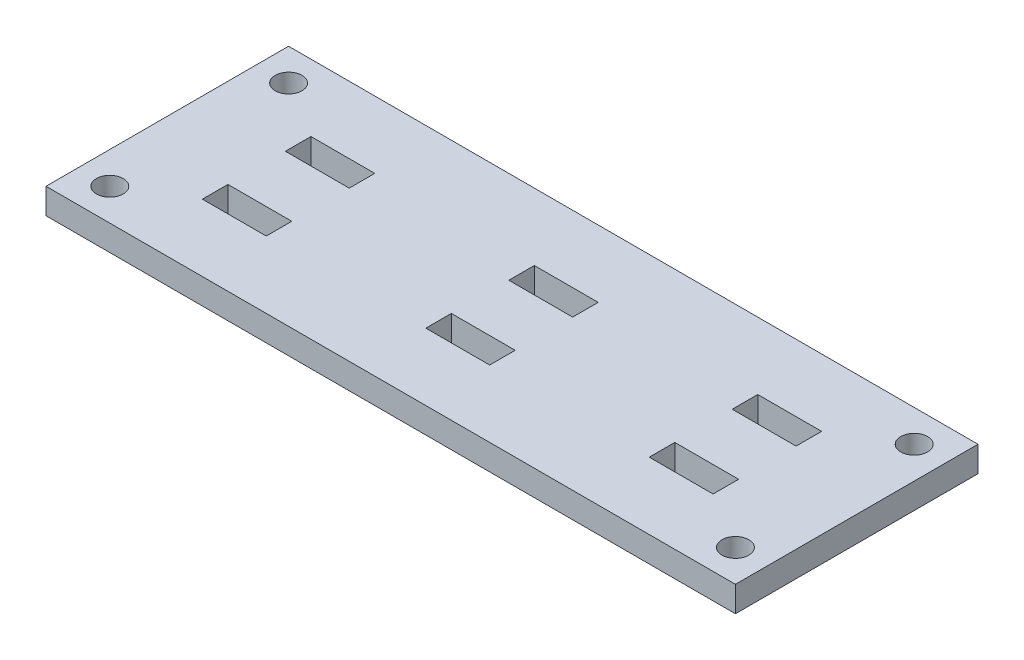
ISO-10303-21;
HEADER;
FILE_DESCRIPTION(('STEP AP214'),'2;1');
FILE_NAME('part.step','',(''),(''),'','','');
FILE_SCHEMA(('AUTOMOTIVE_DESIGN { 1 0 10303 214 1 1 1 1 }'));
ENDSEC;
DATA;
#1=APPLICATION_CONTEXT('core data for automotive mechanical design processes');
#2=APPLICATION_PROTOCOL_DEFINITION('international standard','automotive_design',2000,#1);
#3=PRODUCT_CONTEXT('',#1,'mechanical');
#4=PRODUCT('Part','Part','',(#3));
#5=PRODUCT_RELATED_PRODUCT_CATEGORY('part','',(#4));
#6=PRODUCT_DEFINITION_FORMATION('','',#4);
#7=PRODUCT_DEFINITION_CONTEXT('part definition',#1,'design');
#8=PRODUCT_DEFINITION('design','',#6,#7);
#9=PRODUCT_DEFINITION_SHAPE('','',#8);
#10=(LENGTH_UNIT() NAMED_UNIT(*) SI_UNIT(.MILLI.,.METRE.));
#11=(NAMED_UNIT(*) PLANE_ANGLE_UNIT() SI_UNIT($,.RADIAN.));
#12=(NAMED_UNIT(*) SI_UNIT($,.STERADIAN.) SOLID_ANGLE_UNIT());
#13=UNCERTAINTY_MEASURE_WITH_UNIT(LENGTH_MEASURE(1.E-05),#10,'distance_accuracy_value','');
#14=(GEOMETRIC_REPRESENTATION_CONTEXT(3) GLOBAL_UNCERTAINTY_ASSIGNED_CONTEXT((#13)) GLOBAL_UNIT_ASSIGNED_CONTEXT((#10,
#11,#12)) REPRESENTATION_CONTEXT('',''));
#15=CARTESIAN_POINT('',(0.,0.,0.));
#16=DIRECTION('',(0.,0.,1.));
#17=DIRECTION('',(1.,0.,0.));
#18=AXIS2_PLACEMENT_3D('',#15,#16,#17);
#19=CARTESIAN_POINT('',(0.,4.,0.));
#20=DIRECTION('',(0.,1.,0.));
#21=DIRECTION('',(0.,0.,1.));
#22=AXIS2_PLACEMENT_3D('',#19,#20,#21);
#23=PLANE('',#22);
#24=CARTESIAN_POINT('',(103.,4.,-5.));
#25=DIRECTION('',(0.,1.,0.));
#26=DIRECTION('',(0.,0.,1.));
#27=AXIS2_PLACEMENT_3D('',#24,#25,#26);
#28=CIRCLE('',#27,2.1);
#29=CARTESIAN_POINT('',(103.,4.,-2.9));
#30=VERTEX_POINT('',#29);
#31=EDGE_CURVE('E415',#30,#30,#28,.T.);
#32=ORIENTED_EDGE('',*,*,#31,.F.);
#33=EDGE_LOOP('',(#32));
#34=FACE_BOUND('',#33,.T.);
#35=CARTESIAN_POINT('',(5.,4.,-33.));
#36=DIRECTION('',(0.,1.,0.));
#37=DIRECTION('',(0.,0.,1.));
#38=AXIS2_PLACEMENT_3D('',#35,#36,#37);
#39=CIRCLE('',#38,2.1);
#40=CARTESIAN_POINT('',(5.,4.,-30.9));
#41=VERTEX_POINT('',#40);
#42=EDGE_CURVE('E427',#41,#41,#39,.T.);
#43=ORIENTED_EDGE('',*,*,#42,.F.);
#44=EDGE_LOOP('',(#43));
#45=FACE_BOUND('',#44,.T.);
#46=DIRECTION('',(0.,0.,1.));
#47=VECTOR('',#46,1.);
#48=CARTESIAN_POINT('',(0.,4.,-38.));
#49=LINE('',#48,#47);
#50=CARTESIAN_POINT('',(0.,4.,-38.));
#51=VERTEX_POINT('',#50);
#52=CARTESIAN_POINT('',(0.,4.,0.));
#53=VERTEX_POINT('',#52);
#54=EDGE_CURVE('E433',#51,#53,#49,.T.);
#55=ORIENTED_EDGE('',*,*,#54,.T.);
#56=DIRECTION('',(1.,0.,0.));
#57=VECTOR('',#56,1.);
#58=CARTESIAN_POINT('',(0.,4.,0.));
#59=LINE('',#58,#57);
#60=CARTESIAN_POINT('',(108.,4.,0.));
#61=VERTEX_POINT('',#60);
#62=EDGE_CURVE('E436',#53,#61,#59,.T.);
#63=ORIENTED_EDGE('',*,*,#62,.T.);
#64=DIRECTION('',(0.,0.,-1.));
#65=VECTOR('',#64,1.);
#66=CARTESIAN_POINT('',(108.,4.,-38.));
#67=LINE('',#66,#65);
#68=CARTESIAN_POINT('',(108.,4.,-38.));
#69=VERTEX_POINT('',#68);
#70=EDGE_CURVE('E439',#61,#69,#67,.T.);
#71=ORIENTED_EDGE('',*,*,#70,.T.);
#72=DIRECTION('',(-1.,0.,0.));
#73=VECTOR('',#72,1.);
#74=CARTESIAN_POINT('',(0.,4.,-38.));
#75=LINE('',#74,#73);
#76=EDGE_CURVE('E441',#69,#51,#75,.T.);
#77=ORIENTED_EDGE('',*,*,#76,.T.);
#78=EDGE_LOOP('',(#55,#63,#71,#77));
#79=FACE_BOUND('',#78,.T.);
#80=CARTESIAN_POINT('',(5.,4.,-5.));
#81=DIRECTION('',(0.,1.,0.));
#82=DIRECTION('',(0.,0.,1.));
#83=AXIS2_PLACEMENT_3D('',#80,#81,#82);
#84=CIRCLE('',#83,2.1);
#85=CARTESIAN_POINT('',(5.,4.,-2.9));
#86=VERTEX_POINT('',#85);
#87=EDGE_CURVE('E421',#86,#86,#84,.T.);
#88=ORIENTED_EDGE('',*,*,#87,.F.);
#89=EDGE_LOOP('',(#88));
#90=FACE_BOUND('',#89,.T.);
#91=CARTESIAN_POINT('',(103.,4.,-33.));
#92=DIRECTION('',(0.,1.,0.));
#93=DIRECTION('',(0.,0.,1.));
#94=AXIS2_PLACEMENT_3D('',#91,#92,#93);
#95=CIRCLE('',#94,2.1);
#96=CARTESIAN_POINT('',(103.,4.,-30.9));
#97=VERTEX_POINT('',#96);
#98=EDGE_CURVE('E409',#97,#97,#95,.T.);
#99=ORIENTED_EDGE('',*,*,#98,.F.);
#100=EDGE_LOOP('',(#99));
#101=FACE_BOUND('',#100,.T.);
#102=DIRECTION('',(1.,0.,0.));
#103=VECTOR('',#102,1.);
#104=CARTESIAN_POINT('',(14.,4.,-23.5));
#105=LINE('',#104,#103);
#106=CARTESIAN_POINT('',(14.,4.,-23.5));
#107=VERTEX_POINT('',#106);
#108=CARTESIAN_POINT('',(24.,4.,-23.5));
#109=VERTEX_POINT('',#108);
#110=EDGE_CURVE('E380',#107,#109,#105,.T.);
#111=ORIENTED_EDGE('',*,*,#110,.F.);
#112=DIRECTION('',(0.,0.,1.));
#113=VECTOR('',#112,1.);
#114=CARTESIAN_POINT('',(14.,4.,-23.5));
#115=LINE('',#114,#113);
#116=CARTESIAN_POINT('',(14.,4.,-27.5));
#117=VERTEX_POINT('',#116);
#118=EDGE_CURVE('E378',#117,#107,#115,.T.);
#119=ORIENTED_EDGE('',*,*,#118,.F.);
#120=DIRECTION('',(-1.,0.,0.));
#121=VECTOR('',#120,1.);
#122=CARTESIAN_POINT('',(14.,4.,-27.5));
#123=LINE('',#122,#121);
#124=CARTESIAN_POINT('',(24.,4.,-27.5));
#125=VERTEX_POINT('',#124);
#126=EDGE_CURVE('E386',#125,#117,#123,.T.);
#127=ORIENTED_EDGE('',*,*,#126,.F.);
#128=DIRECTION('',(0.,0.,-1.));
#129=VECTOR('',#128,1.);
#130=CARTESIAN_POINT('',(24.,4.,-23.5));
#131=LINE('',#130,#129);
#132=EDGE_CURVE('E383',#109,#125,#131,.T.);
#133=ORIENTED_EDGE('',*,*,#132,.F.);
#134=EDGE_LOOP('',(#111,#119,#127,#133));
#135=FACE_BOUND('',#134,.T.);
#136=DIRECTION('',(1.,0.,0.));
#137=VECTOR('',#136,1.);
#138=CARTESIAN_POINT('',(14.,4.,-10.5));
#139=LINE('',#138,#137);
#140=CARTESIAN_POINT('',(14.,4.,-10.5));
#141=VERTEX_POINT('',#140);
#142=CARTESIAN_POINT('',(24.,4.,-10.5));
#143=VERTEX_POINT('',#142);
#144=EDGE_CURVE('E349',#141,#143,#139,.T.);
#145=ORIENTED_EDGE('',*,*,#144,.F.);
#146=DIRECTION('',(0.,0.,1.));
#147=VECTOR('',#146,1.);
#148=CARTESIAN_POINT('',(14.,4.,-14.5));
#149=LINE('',#148,#147);
#150=CARTESIAN_POINT('',(14.,4.,-14.5));
#151=VERTEX_POINT('',#150);
#152=EDGE_CURVE('E347',#151,#141,#149,.T.);
#153=ORIENTED_EDGE('',*,*,#152,.F.);
#154=DIRECTION('',(-1.,0.,0.));
#155=VECTOR('',#154,1.);
#156=CARTESIAN_POINT('',(14.,4.,-14.5));
#157=LINE('',#156,#155);
#158=CARTESIAN_POINT('',(24.,4.,-14.5));
#159=VERTEX_POINT('',#158);
#160=EDGE_CURVE('E355',#159,#151,#157,.T.);
#161=ORIENTED_EDGE('',*,*,#160,.F.);
#162=DIRECTION('',(0.,0.,-1.));
#163=VECTOR('',#162,1.);
#164=CARTESIAN_POINT('',(24.,4.,-14.5));
#165=LINE('',#164,#163);
#166=EDGE_CURVE('E352',#143,#159,#165,.T.);
#167=ORIENTED_EDGE('',*,*,#166,.F.);
#168=EDGE_LOOP('',(#145,#153,#161,#167));
#169=FACE_BOUND('',#168,.T.);
#170=DIRECTION('',(0.,0.,-1.));
#171=VECTOR('',#170,1.);
#172=CARTESIAN_POINT('',(59.,4.,-23.5));
#173=LINE('',#172,#171);
#174=CARTESIAN_POINT('',(59.,4.,-23.5));
#175=VERTEX_POINT('',#174);
#176=CARTESIAN_POINT('',(59.,4.,-27.5));
#177=VERTEX_POINT('',#176);
#178=EDGE_CURVE('E318',#175,#177,#173,.T.);
#179=ORIENTED_EDGE('',*,*,#178,.F.);
#180=DIRECTION('',(1.,0.,0.));
#181=VECTOR('',#180,1.);
#182=CARTESIAN_POINT('',(49.,4.,-23.5));
#183=LINE('',#182,#181);
#184=CARTESIAN_POINT('',(49.,4.,-23.5));
#185=VERTEX_POINT('',#184);
#186=EDGE_CURVE('E316',#185,#175,#183,.T.);
#187=ORIENTED_EDGE('',*,*,#186,.F.);
#188=DIRECTION('',(0.,0.,1.));
#189=VECTOR('',#188,1.);
#190=CARTESIAN_POINT('',(49.,4.,-23.5));
#191=LINE('',#190,#189);
#192=CARTESIAN_POINT('',(49.,4.,-27.5));
#193=VERTEX_POINT('',#192);
#194=EDGE_CURVE('E324',#193,#185,#191,.T.);
#195=ORIENTED_EDGE('',*,*,#194,.F.);
#196=DIRECTION('',(-1.,0.,0.));
#197=VECTOR('',#196,1.);
#198=CARTESIAN_POINT('',(49.,4.,-27.5));
#199=LINE('',#198,#197);
#200=EDGE_CURVE('E321',#177,#193,#199,.T.);
#201=ORIENTED_EDGE('',*,*,#200,.F.);
#202=EDGE_LOOP('',(#179,#187,#195,#201));
#203=FACE_BOUND('',#202,.T.);
#204=DIRECTION('',(0.,0.,1.));
#205=VECTOR('',#204,1.);
#206=CARTESIAN_POINT('',(49.,4.,-14.5));
#207=LINE('',#206,#205);
#208=CARTESIAN_POINT('',(49.,4.,-14.5));
#209=VERTEX_POINT('',#208);
#210=CARTESIAN_POINT('',(49.,4.,-10.5));
#211=VERTEX_POINT('',#210);
#212=EDGE_CURVE('E287',#209,#211,#207,.T.);
#213=ORIENTED_EDGE('',*,*,#212,.F.);
#214=DIRECTION('',(-1.,0.,0.));
#215=VECTOR('',#214,1.);
#216=CARTESIAN_POINT('',(49.,4.,-14.5));
#217=LINE('',#216,#215);
#218=CARTESIAN_POINT('',(59.,4.,-14.5));
#219=VERTEX_POINT('',#218);
#220=EDGE_CURVE('E285',#219,#209,#217,.T.);
#221=ORIENTED_EDGE('',*,*,#220,.F.);
#222=DIRECTION('',(0.,0.,-1.));
#223=VECTOR('',#222,1.);
#224=CARTESIAN_POINT('',(59.,4.,-14.5));
#225=LINE('',#224,#223);
#226=CARTESIAN_POINT('',(59.,4.,-10.5));
#227=VERTEX_POINT('',#226);
#228=EDGE_CURVE('E293',#227,#219,#225,.T.);
#229=ORIENTED_EDGE('',*,*,#228,.F.);
#230=DIRECTION('',(1.,0.,0.));
#231=VECTOR('',#230,1.);
#232=CARTESIAN_POINT('',(49.,4.,-10.5));
#233=LINE('',#232,#231);
#234=EDGE_CURVE('E290',#211,#227,#233,.T.);
#235=ORIENTED_EDGE('',*,*,#234,.F.);
#236=EDGE_LOOP('',(#213,#221,#229,#235));
#237=FACE_BOUND('',#236,.T.);
#238=DIRECTION('',(0.,0.,-1.));
#239=VECTOR('',#238,1.);
#240=CARTESIAN_POINT('',(94.,4.,-23.5));
#241=LINE('',#240,#239);
#242=CARTESIAN_POINT('',(94.,4.,-23.5));
#243=VERTEX_POINT('',#242);
#244=CARTESIAN_POINT('',(94.,4.,-27.5));
#245=VERTEX_POINT('',#244);
#246=EDGE_CURVE('E256',#243,#245,#241,.T.);
#247=ORIENTED_EDGE('',*,*,#246,.F.);
#248=DIRECTION('',(1.,0.,0.));
#249=VECTOR('',#248,1.);
#250=CARTESIAN_POINT('',(84.,4.,-23.5));
#251=LINE('',#250,#249);
#252=CARTESIAN_POINT('',(84.,4.,-23.5));
#253=VERTEX_POINT('',#252);
#254=EDGE_CURVE('E254',#253,#243,#251,.T.);
#255=ORIENTED_EDGE('',*,*,#254,.F.);
#256=DIRECTION('',(0.,0.,1.));
#257=VECTOR('',#256,1.);
#258=CARTESIAN_POINT('',(84.,4.,-23.5));
#259=LINE('',#258,#257);
#260=CARTESIAN_POINT('',(84.,4.,-27.5));
#261=VERTEX_POINT('',#260);
#262=EDGE_CURVE('E262',#261,#253,#259,.T.);
#263=ORIENTED_EDGE('',*,*,#262,.F.);
#264=DIRECTION('',(-1.,0.,0.));
#265=VECTOR('',#264,1.);
#266=CARTESIAN_POINT('',(84.,4.,-27.5));
#267=LINE('',#266,#265);
#268=EDGE_CURVE('E259',#245,#261,#267,.T.);
#269=ORIENTED_EDGE('',*,*,#268,.F.);
#270=EDGE_LOOP('',(#247,#255,#263,#269));
#271=FACE_BOUND('',#270,.T.);
#272=DIRECTION('',(0.,0.,1.));
#273=VECTOR('',#272,1.);
#274=CARTESIAN_POINT('',(84.,4.,-14.5));
#275=LINE('',#274,#273);
#276=CARTESIAN_POINT('',(84.,4.,-14.5));
#277=VERTEX_POINT('',#276);
#278=CARTESIAN_POINT('',(84.,4.,-10.5));
#279=VERTEX_POINT('',#278);
#280=EDGE_CURVE('E226',#277,#279,#275,.T.);
#281=ORIENTED_EDGE('',*,*,#280,.F.);
#282=DIRECTION('',(-1.,0.,0.));
#283=VECTOR('',#282,1.);
#284=CARTESIAN_POINT('',(84.,4.,-14.5));
#285=LINE('',#284,#283);
#286=CARTESIAN_POINT('',(94.,4.,-14.5));
#287=VERTEX_POINT('',#286);
#288=EDGE_CURVE('E218',#287,#277,#285,.T.);
#289=ORIENTED_EDGE('',*,*,#288,.F.);
#290=DIRECTION('',(0.,0.,-1.));
#291=VECTOR('',#290,1.);
#292=CARTESIAN_POINT('',(94.,4.,-14.5));
#293=LINE('',#292,#291);
#294=CARTESIAN_POINT('',(94.,4.,-10.5));
#295=VERTEX_POINT('',#294);
#296=EDGE_CURVE('E240',#295,#287,#293,.T.);
#297=ORIENTED_EDGE('',*,*,#296,.F.);
#298=DIRECTION('',(1.,0.,0.));
#299=VECTOR('',#298,1.);
#300=CARTESIAN_POINT('',(84.,4.,-10.5));
#301=LINE('',#300,#299);
#302=EDGE_CURVE('E238',#279,#295,#301,.T.);
#303=ORIENTED_EDGE('',*,*,#302,.F.);
#304=EDGE_LOOP('',(#281,#289,#297,#303));
#305=FACE_BOUND('',#304,.T.);
#306=ADVANCED_FACE('F33',(#34,#45,#79,#90,#101,#135,#169,#203,#237,#271,#305),#23,.T.);
#307=CARTESIAN_POINT('',(0.,0.,0.));
#308=DIRECTION('',(0.,1.,0.));
#309=DIRECTION('',(0.,0.,1.));
#310=AXIS2_PLACEMENT_3D('',#307,#308,#309);
#311=PLANE('',#310);
#312=DIRECTION('',(1.,0.,0.));
#313=VECTOR('',#312,1.);
#314=CARTESIAN_POINT('',(84.,0.,-23.5));
#315=LINE('',#314,#313);
#316=CARTESIAN_POINT('',(84.,0.,-23.5));
#317=VERTEX_POINT('',#316);
#318=CARTESIAN_POINT('',(94.,0.,-23.5));
#319=VERTEX_POINT('',#318);
#320=EDGE_CURVE('E234',#317,#319,#315,.T.);
#321=ORIENTED_EDGE('',*,*,#320,.T.);
#322=DIRECTION('',(0.,0.,-1.));
#323=VECTOR('',#322,1.);
#324=CARTESIAN_POINT('',(94.,0.,-23.5));
#325=LINE('',#324,#323);
#326=CARTESIAN_POINT('',(94.,0.,-27.5));
#327=VERTEX_POINT('',#326);
#328=EDGE_CURVE('E267',#319,#327,#325,.T.);
#329=ORIENTED_EDGE('',*,*,#328,.T.);
#330=DIRECTION('',(-1.,0.,0.));
#331=VECTOR('',#330,1.);
#332=CARTESIAN_POINT('',(84.,0.,-27.5));
#333=LINE('',#332,#331);
#334=CARTESIAN_POINT('',(84.,0.,-27.5));
#335=VERTEX_POINT('',#334);
#336=EDGE_CURVE('E270',#327,#335,#333,.T.);
#337=ORIENTED_EDGE('',*,*,#336,.T.);
#338=DIRECTION('',(0.,0.,1.));
#339=VECTOR('',#338,1.);
#340=CARTESIAN_POINT('',(84.,0.,-23.5));
#341=LINE('',#340,#339);
#342=EDGE_CURVE('E257',#335,#317,#341,.T.);
#343=ORIENTED_EDGE('',*,*,#342,.T.);
#344=EDGE_LOOP('',(#321,#329,#337,#343));
#345=FACE_BOUND('',#344,.T.);
#346=DIRECTION('',(1.,0.,0.));
#347=VECTOR('',#346,1.);
#348=CARTESIAN_POINT('',(49.,0.,-23.5));
#349=LINE('',#348,#347);
#350=CARTESIAN_POINT('',(49.,0.,-23.5));
#351=VERTEX_POINT('',#350);
#352=CARTESIAN_POINT('',(59.,0.,-23.5));
#353=VERTEX_POINT('',#352);
#354=EDGE_CURVE('E315',#351,#353,#349,.T.);
#355=ORIENTED_EDGE('',*,*,#354,.T.);
#356=DIRECTION('',(0.,0.,-1.));
#357=VECTOR('',#356,1.);
#358=CARTESIAN_POINT('',(59.,0.,-23.5));
#359=LINE('',#358,#357);
#360=CARTESIAN_POINT('',(59.,0.,-27.5));
#361=VERTEX_POINT('',#360);
#362=EDGE_CURVE('E329',#353,#361,#359,.T.);
#363=ORIENTED_EDGE('',*,*,#362,.T.);
#364=DIRECTION('',(-1.,0.,0.));
#365=VECTOR('',#364,1.);
#366=CARTESIAN_POINT('',(49.,0.,-27.5));
#367=LINE('',#366,#365);
#368=CARTESIAN_POINT('',(49.,0.,-27.5));
#369=VERTEX_POINT('',#368);
#370=EDGE_CURVE('E332',#361,#369,#367,.T.);
#371=ORIENTED_EDGE('',*,*,#370,.T.);
#372=DIRECTION('',(0.,0.,1.));
#373=VECTOR('',#372,1.);
#374=CARTESIAN_POINT('',(49.,0.,-23.5));
#375=LINE('',#374,#373);
#376=EDGE_CURVE('E319',#369,#351,#375,.T.);
#377=ORIENTED_EDGE('',*,*,#376,.T.);
#378=EDGE_LOOP('',(#355,#363,#371,#377));
#379=FACE_BOUND('',#378,.T.);
#380=DIRECTION('',(0.,0.,1.));
#381=VECTOR('',#380,1.);
#382=CARTESIAN_POINT('',(14.,0.,-23.5));
#383=LINE('',#382,#381);
#384=CARTESIAN_POINT('',(14.,0.,-27.5));
#385=VERTEX_POINT('',#384);
#386=CARTESIAN_POINT('',(14.,0.,-23.5));
#387=VERTEX_POINT('',#386);
#388=EDGE_CURVE('E377',#385,#387,#383,.T.);
#389=ORIENTED_EDGE('',*,*,#388,.T.);
#390=DIRECTION('',(1.,0.,0.));
#391=VECTOR('',#390,1.);
#392=CARTESIAN_POINT('',(14.,0.,-23.5));
#393=LINE('',#392,#391);
#394=CARTESIAN_POINT('',(24.,0.,-23.5));
#395=VERTEX_POINT('',#394);
#396=EDGE_CURVE('E391',#387,#395,#393,.T.);
#397=ORIENTED_EDGE('',*,*,#396,.T.);
#398=DIRECTION('',(0.,0.,-1.));
#399=VECTOR('',#398,1.);
#400=CARTESIAN_POINT('',(24.,0.,-23.5));
#401=LINE('',#400,#399);
#402=CARTESIAN_POINT('',(24.,0.,-27.5));
#403=VERTEX_POINT('',#402);
#404=EDGE_CURVE('E394',#395,#403,#401,.T.);
#405=ORIENTED_EDGE('',*,*,#404,.T.);
#406=DIRECTION('',(-1.,0.,0.));
#407=VECTOR('',#406,1.);
#408=CARTESIAN_POINT('',(14.,0.,-27.5));
#409=LINE('',#408,#407);
#410=EDGE_CURVE('E381',#403,#385,#409,.T.);
#411=ORIENTED_EDGE('',*,*,#410,.T.);
#412=EDGE_LOOP('',(#389,#397,#405,#411));
#413=FACE_BOUND('',#412,.T.);
#414=DIRECTION('',(0.,0.,1.));
#415=VECTOR('',#414,1.);
#416=CARTESIAN_POINT('',(0.,0.,-38.));
#417=LINE('',#416,#415);
#418=CARTESIAN_POINT('',(0.,0.,-38.));
#419=VERTEX_POINT('',#418);
#420=CARTESIAN_POINT('',(0.,0.,0.));
#421=VERTEX_POINT('',#420);
#422=EDGE_CURVE('E430',#419,#421,#417,.T.);
#423=ORIENTED_EDGE('',*,*,#422,.F.);
#424=DIRECTION('',(-1.,0.,0.));
#425=VECTOR('',#424,1.);
#426=CARTESIAN_POINT('',(0.,0.,-38.));
#427=LINE('',#426,#425);
#428=CARTESIAN_POINT('',(108.,0.,-38.));
#429=VERTEX_POINT('',#428);
#430=EDGE_CURVE('E437',#429,#419,#427,.T.);
#431=ORIENTED_EDGE('',*,*,#430,.F.);
#432=DIRECTION('',(0.,0.,-1.));
#433=VECTOR('',#432,1.);
#434=CARTESIAN_POINT('',(108.,0.,-38.));
#435=LINE('',#434,#433);
#436=CARTESIAN_POINT('',(108.,0.,0.));
#437=VERTEX_POINT('',#436);
#438=EDGE_CURVE('E448',#437,#429,#435,.T.);
#439=ORIENTED_EDGE('',*,*,#438,.F.);
#440=DIRECTION('',(1.,0.,0.));
#441=VECTOR('',#440,1.);
#442=CARTESIAN_POINT('',(0.,0.,0.));
#443=LINE('',#442,#441);
#444=EDGE_CURVE('E446',#421,#437,#443,.T.);
#445=ORIENTED_EDGE('',*,*,#444,.F.);
#446=EDGE_LOOP('',(#423,#431,#439,#445));
#447=FACE_BOUND('',#446,.T.);
#448=CARTESIAN_POINT('',(5.,0.,-33.));
#449=DIRECTION('',(0.,1.,0.));
#450=DIRECTION('',(0.,0.,1.));
#451=AXIS2_PLACEMENT_3D('',#448,#449,#450);
#452=CIRCLE('',#451,2.1);
#453=CARTESIAN_POINT('',(5.,0.,-30.9));
#454=VERTEX_POINT('',#453);
#455=EDGE_CURVE('E424',#454,#454,#452,.T.);
#456=ORIENTED_EDGE('',*,*,#455,.T.);
#457=EDGE_LOOP('',(#456));
#458=FACE_BOUND('',#457,.T.);
#459=CARTESIAN_POINT('',(5.,0.,-5.));
#460=DIRECTION('',(0.,1.,0.));
#461=DIRECTION('',(0.,0.,1.));
#462=AXIS2_PLACEMENT_3D('',#459,#460,#461);
#463=CIRCLE('',#462,2.1);
#464=CARTESIAN_POINT('',(5.,0.,-2.9));
#465=VERTEX_POINT('',#464);
#466=EDGE_CURVE('E418',#465,#465,#463,.T.);
#467=ORIENTED_EDGE('',*,*,#466,.T.);
#468=EDGE_LOOP('',(#467));
#469=FACE_BOUND('',#468,.T.);
#470=CARTESIAN_POINT('',(103.,0.,-5.));
#471=DIRECTION('',(0.,1.,0.));
#472=DIRECTION('',(0.,0.,1.));
#473=AXIS2_PLACEMENT_3D('',#470,#471,#472);
#474=CIRCLE('',#473,2.1);
#475=CARTESIAN_POINT('',(103.,0.,-2.9));
#476=VERTEX_POINT('',#475);
#477=EDGE_CURVE('E412',#476,#476,#474,.T.);
#478=ORIENTED_EDGE('',*,*,#477,.T.);
#479=EDGE_LOOP('',(#478));
#480=FACE_BOUND('',#479,.T.);
#481=CARTESIAN_POINT('',(103.,0.,-33.));
#482=DIRECTION('',(0.,1.,0.));
#483=DIRECTION('',(0.,0.,1.));
#484=AXIS2_PLACEMENT_3D('',#481,#482,#483);
#485=CIRCLE('',#484,2.1);
#486=CARTESIAN_POINT('',(103.,0.,-30.9));
#487=VERTEX_POINT('',#486);
#488=EDGE_CURVE('E408',#487,#487,#485,.T.);
#489=ORIENTED_EDGE('',*,*,#488,.T.);
#490=EDGE_LOOP('',(#489));
#491=FACE_BOUND('',#490,.T.);
#492=DIRECTION('',(0.,0.,1.));
#493=VECTOR('',#492,1.);
#494=CARTESIAN_POINT('',(14.,0.,-14.5));
#495=LINE('',#494,#493);
#496=CARTESIAN_POINT('',(14.,0.,-14.5));
#497=VERTEX_POINT('',#496);
#498=CARTESIAN_POINT('',(14.,0.,-10.5));
#499=VERTEX_POINT('',#498);
#500=EDGE_CURVE('E346',#497,#499,#495,.T.);
#501=ORIENTED_EDGE('',*,*,#500,.T.);
#502=DIRECTION('',(1.,0.,0.));
#503=VECTOR('',#502,1.);
#504=CARTESIAN_POINT('',(14.,0.,-10.5));
#505=LINE('',#504,#503);
#506=CARTESIAN_POINT('',(24.,0.,-10.5));
#507=VERTEX_POINT('',#506);
#508=EDGE_CURVE('E360',#499,#507,#505,.T.);
#509=ORIENTED_EDGE('',*,*,#508,.T.);
#510=DIRECTION('',(0.,0.,-1.));
#511=VECTOR('',#510,1.);
#512=CARTESIAN_POINT('',(24.,0.,-14.5));
#513=LINE('',#512,#511);
#514=CARTESIAN_POINT('',(24.,0.,-14.5));
#515=VERTEX_POINT('',#514);
#516=EDGE_CURVE('E363',#507,#515,#513,.T.);
#517=ORIENTED_EDGE('',*,*,#516,.T.);
#518=DIRECTION('',(-1.,0.,0.));
#519=VECTOR('',#518,1.);
#520=CARTESIAN_POINT('',(14.,0.,-14.5));
#521=LINE('',#520,#519);
#522=EDGE_CURVE('E350',#515,#497,#521,.T.);
#523=ORIENTED_EDGE('',*,*,#522,.T.);
#524=EDGE_LOOP('',(#501,#509,#517,#523));
#525=FACE_BOUND('',#524,.T.);
#526=DIRECTION('',(-1.,0.,0.));
#527=VECTOR('',#526,1.);
#528=CARTESIAN_POINT('',(49.,0.,-14.5));
#529=LINE('',#528,#527);
#530=CARTESIAN_POINT('',(59.,0.,-14.5));
#531=VERTEX_POINT('',#530);
#532=CARTESIAN_POINT('',(49.,0.,-14.5));
#533=VERTEX_POINT('',#532);
#534=EDGE_CURVE('E284',#531,#533,#529,.T.);
#535=ORIENTED_EDGE('',*,*,#534,.T.);
#536=DIRECTION('',(0.,0.,1.));
#537=VECTOR('',#536,1.);
#538=CARTESIAN_POINT('',(49.,0.,-14.5));
#539=LINE('',#538,#537);
#540=CARTESIAN_POINT('',(49.,0.,-10.5));
#541=VERTEX_POINT('',#540);
#542=EDGE_CURVE('E298',#533,#541,#539,.T.);
#543=ORIENTED_EDGE('',*,*,#542,.T.);
#544=DIRECTION('',(1.,0.,0.));
#545=VECTOR('',#544,1.);
#546=CARTESIAN_POINT('',(49.,0.,-10.5));
#547=LINE('',#546,#545);
#548=CARTESIAN_POINT('',(59.,0.,-10.5));
#549=VERTEX_POINT('',#548);
#550=EDGE_CURVE('E301',#541,#549,#547,.T.);
#551=ORIENTED_EDGE('',*,*,#550,.T.);
#552=DIRECTION('',(0.,0.,-1.));
#553=VECTOR('',#552,1.);
#554=CARTESIAN_POINT('',(59.,0.,-14.5));
#555=LINE('',#554,#553);
#556=EDGE_CURVE('E288',#549,#531,#555,.T.);
#557=ORIENTED_EDGE('',*,*,#556,.T.);
#558=EDGE_LOOP('',(#535,#543,#551,#557));
#559=FACE_BOUND('',#558,.T.);
#560=DIRECTION('',(-1.,0.,0.));
#561=VECTOR('',#560,1.);
#562=CARTESIAN_POINT('',(84.,0.,-14.5));
#563=LINE('',#562,#561);
#564=CARTESIAN_POINT('',(94.,0.,-14.5));
#565=VERTEX_POINT('',#564);
#566=CARTESIAN_POINT('',(84.,0.,-14.5));
#567=VERTEX_POINT('',#566);
#568=EDGE_CURVE('E56',#565,#567,#563,.T.);
#569=ORIENTED_EDGE('',*,*,#568,.T.);
#570=DIRECTION('',(0.,0.,1.));
#571=VECTOR('',#570,1.);
#572=CARTESIAN_POINT('',(84.,0.,-14.5));
#573=LINE('',#572,#571);
#574=CARTESIAN_POINT('',(84.,0.,-10.5));
#575=VERTEX_POINT('',#574);
#576=EDGE_CURVE('E233',#567,#575,#573,.T.);
#577=ORIENTED_EDGE('',*,*,#576,.T.);
#578=DIRECTION('',(1.,0.,0.));
#579=VECTOR('',#578,1.);
#580=CARTESIAN_POINT('',(84.,0.,-10.5));
#581=LINE('',#580,#579);
#582=CARTESIAN_POINT('',(94.,0.,-10.5));
#583=VERTEX_POINT('',#582);
#584=EDGE_CURVE('E246',#575,#583,#581,.T.);
#585=ORIENTED_EDGE('',*,*,#584,.T.);
#586=DIRECTION('',(0.,0.,-1.));
#587=VECTOR('',#586,1.);
#588=CARTESIAN_POINT('',(94.,0.,-14.5));
#589=LINE('',#588,#587);
#590=EDGE_CURVE('E227',#583,#565,#589,.T.);
#591=ORIENTED_EDGE('',*,*,#590,.T.);
#592=EDGE_LOOP('',(#569,#577,#585,#591));
#593=FACE_BOUND('',#592,.T.);
#594=ADVANCED_FACE('F466',(#345,#379,#413,#447,#458,#469,#480,#491,#525,#559,#593),#311,.F.);
#595=CARTESIAN_POINT('',(0.,4.,-38.));
#596=DIRECTION('',(1.,0.,0.));
#597=DIRECTION('',(0.,0.,-1.));
#598=AXIS2_PLACEMENT_3D('',#595,#596,#597);
#599=PLANE('',#598);
#600=ORIENTED_EDGE('',*,*,#422,.T.);
#601=DIRECTION('',(0.,-1.,0.));
#602=VECTOR('',#601,1.);
#603=CARTESIAN_POINT('',(0.,4.,0.));
#604=LINE('',#603,#602);
#605=EDGE_CURVE('E11',#53,#421,#604,.T.);
#606=ORIENTED_EDGE('',*,*,#605,.F.);
#607=ORIENTED_EDGE('',*,*,#54,.F.);
#608=DIRECTION('',(0.,-1.,0.));
#609=VECTOR('',#608,1.);
#610=CARTESIAN_POINT('',(0.,4.,-38.));
#611=LINE('',#610,#609);
#612=EDGE_CURVE('E443',#51,#419,#611,.T.);
#613=ORIENTED_EDGE('',*,*,#612,.T.);
#614=EDGE_LOOP('',(#600,#606,#607,#613));
#615=FACE_BOUND('',#614,.T.);
#616=ADVANCED_FACE('F35',(#615),#599,.F.);
#617=CARTESIAN_POINT('',(0.,4.,0.));
#618=DIRECTION('',(0.,0.,-1.));
#619=DIRECTION('',(-1.,0.,0.));
#620=AXIS2_PLACEMENT_3D('',#617,#618,#619);
#621=PLANE('',#620);
#622=ORIENTED_EDGE('',*,*,#444,.T.);
#623=DIRECTION('',(0.,-1.,0.));
#624=VECTOR('',#623,1.);
#625=CARTESIAN_POINT('',(108.,4.,0.));
#626=LINE('',#625,#624);
#627=EDGE_CURVE('E41',#61,#437,#626,.T.);
#628=ORIENTED_EDGE('',*,*,#627,.F.);
#629=ORIENTED_EDGE('',*,*,#62,.F.);
#630=ORIENTED_EDGE('',*,*,#605,.T.);
#631=EDGE_LOOP('',(#622,#628,#629,#630));
#632=FACE_BOUND('',#631,.T.);
#633=ADVANCED_FACE('F477',(#632),#621,.F.);
#634=CARTESIAN_POINT('',(108.,4.,-38.));
#635=DIRECTION('',(-1.,0.,0.));
#636=DIRECTION('',(0.,0.,1.));
#637=AXIS2_PLACEMENT_3D('',#634,#635,#636);
#638=PLANE('',#637);
#639=ORIENTED_EDGE('',*,*,#438,.T.);
#640=DIRECTION('',(0.,-1.,0.));
#641=VECTOR('',#640,1.);
#642=CARTESIAN_POINT('',(108.,4.,-38.));
#643=LINE('',#642,#641);
#644=EDGE_CURVE('E453',#69,#429,#643,.T.);
#645=ORIENTED_EDGE('',*,*,#644,.F.);
#646=ORIENTED_EDGE('',*,*,#70,.F.);
#647=ORIENTED_EDGE('',*,*,#627,.T.);
#648=EDGE_LOOP('',(#639,#645,#646,#647));
#649=FACE_BOUND('',#648,.T.);
#650=ADVANCED_FACE('F460',(#649),#638,.F.);
#651=CARTESIAN_POINT('',(0.,4.,-38.));
#652=DIRECTION('',(0.,0.,1.));
#653=DIRECTION('',(1.,0.,0.));
#654=AXIS2_PLACEMENT_3D('',#651,#652,#653);
#655=PLANE('',#654);
#656=ORIENTED_EDGE('',*,*,#430,.T.);
#657=ORIENTED_EDGE('',*,*,#612,.F.);
#658=ORIENTED_EDGE('',*,*,#76,.F.);
#659=ORIENTED_EDGE('',*,*,#644,.T.);
#660=EDGE_LOOP('',(#656,#657,#658,#659));
#661=FACE_BOUND('',#660,.T.);
#662=ADVANCED_FACE('F470',(#661),#655,.F.);
#663=CARTESIAN_POINT('',(5.,4.,-33.));
#664=DIRECTION('',(0.,-1.,0.));
#665=DIRECTION('',(0.,0.,-1.));
#666=AXIS2_PLACEMENT_3D('',#663,#664,#665);
#667=CYLINDRICAL_SURFACE('',#666,2.1);
#668=ORIENTED_EDGE('',*,*,#42,.T.);
#669=EDGE_LOOP('',(#668));
#670=FACE_BOUND('',#669,.T.);
#671=ORIENTED_EDGE('',*,*,#455,.F.);
#672=EDGE_LOOP('',(#671));
#673=FACE_BOUND('',#672,.T.);
#674=ADVANCED_FACE('F495',(#670,#673),#667,.F.);
#675=CARTESIAN_POINT('',(5.,4.,-5.));
#676=DIRECTION('',(0.,-1.,0.));
#677=DIRECTION('',(0.,0.,-1.));
#678=AXIS2_PLACEMENT_3D('',#675,#676,#677);
#679=CYLINDRICAL_SURFACE('',#678,2.1);
#680=ORIENTED_EDGE('',*,*,#87,.T.);
#681=EDGE_LOOP('',(#680));
#682=FACE_BOUND('',#681,.T.);
#683=ORIENTED_EDGE('',*,*,#466,.F.);
#684=EDGE_LOOP('',(#683));
#685=FACE_BOUND('',#684,.T.);
#686=ADVANCED_FACE('F502',(#682,#685),#679,.F.);
#687=CARTESIAN_POINT('',(103.,4.,-5.));
#688=DIRECTION('',(0.,-1.,0.));
#689=DIRECTION('',(0.,0.,-1.));
#690=AXIS2_PLACEMENT_3D('',#687,#688,#689);
#691=CYLINDRICAL_SURFACE('',#690,2.1);
#692=ORIENTED_EDGE('',*,*,#31,.T.);
#693=EDGE_LOOP('',(#692));
#694=FACE_BOUND('',#693,.T.);
#695=ORIENTED_EDGE('',*,*,#477,.F.);
#696=EDGE_LOOP('',(#695));
#697=FACE_BOUND('',#696,.T.);
#698=ADVANCED_FACE('F507',(#694,#697),#691,.F.);
#699=CARTESIAN_POINT('',(103.,4.,-33.));
#700=DIRECTION('',(0.,-1.,0.));
#701=DIRECTION('',(0.,0.,-1.));
#702=AXIS2_PLACEMENT_3D('',#699,#700,#701);
#703=CYLINDRICAL_SURFACE('',#702,2.1);
#704=ORIENTED_EDGE('',*,*,#98,.T.);
#705=EDGE_LOOP('',(#704));
#706=FACE_BOUND('',#705,.T.);
#707=ORIENTED_EDGE('',*,*,#488,.F.);
#708=EDGE_LOOP('',(#707));
#709=FACE_BOUND('',#708,.T.);
#710=ADVANCED_FACE('F615',(#706,#709),#703,.F.);
#711=CARTESIAN_POINT('',(14.,4.,-23.5));
#712=DIRECTION('',(1.,0.,0.));
#713=DIRECTION('',(0.,0.,-1.));
#714=AXIS2_PLACEMENT_3D('',#711,#712,#713);
#715=PLANE('',#714);
#716=ORIENTED_EDGE('',*,*,#388,.F.);
#717=DIRECTION('',(0.,-1.,0.));
#718=VECTOR('',#717,1.);
#719=CARTESIAN_POINT('',(14.,4.,-27.5));
#720=LINE('',#719,#718);
#721=EDGE_CURVE('E388',#117,#385,#720,.T.);
#722=ORIENTED_EDGE('',*,*,#721,.F.);
#723=ORIENTED_EDGE('',*,*,#118,.T.);
#724=DIRECTION('',(0.,-1.,0.));
#725=VECTOR('',#724,1.);
#726=CARTESIAN_POINT('',(14.,4.,-23.5));
#727=LINE('',#726,#725);
#728=EDGE_CURVE('E405',#107,#387,#727,.T.);
#729=ORIENTED_EDGE('',*,*,#728,.T.);
#730=EDGE_LOOP('',(#716,#722,#723,#729));
#731=FACE_BOUND('',#730,.T.);
#732=ADVANCED_FACE('F611',(#731),#715,.T.);
#733=CARTESIAN_POINT('',(14.,4.,-23.5));
#734=DIRECTION('',(0.,0.,-1.));
#735=DIRECTION('',(-1.,0.,0.));
#736=AXIS2_PLACEMENT_3D('',#733,#734,#735);
#737=PLANE('',#736);
#738=ORIENTED_EDGE('',*,*,#396,.F.);
#739=ORIENTED_EDGE('',*,*,#728,.F.);
#740=ORIENTED_EDGE('',*,*,#110,.T.);
#741=DIRECTION('',(0.,-1.,0.));
#742=VECTOR('',#741,1.);
#743=CARTESIAN_POINT('',(24.,4.,-23.5));
#744=LINE('',#743,#742);
#745=EDGE_CURVE('E403',#109,#395,#744,.T.);
#746=ORIENTED_EDGE('',*,*,#745,.T.);
#747=EDGE_LOOP('',(#738,#739,#740,#746));
#748=FACE_BOUND('',#747,.T.);
#749=ADVANCED_FACE('F607',(#748),#737,.T.);
#750=CARTESIAN_POINT('',(24.,4.,-23.5));
#751=DIRECTION('',(-1.,0.,0.));
#752=DIRECTION('',(0.,0.,1.));
#753=AXIS2_PLACEMENT_3D('',#750,#751,#752);
#754=PLANE('',#753);
#755=ORIENTED_EDGE('',*,*,#404,.F.);
#756=ORIENTED_EDGE('',*,*,#745,.F.);
#757=ORIENTED_EDGE('',*,*,#132,.T.);
#758=DIRECTION('',(0.,-1.,0.));
#759=VECTOR('',#758,1.);
#760=CARTESIAN_POINT('',(24.,4.,-27.5));
#761=LINE('',#760,#759);
#762=EDGE_CURVE('E401',#125,#403,#761,.T.);
#763=ORIENTED_EDGE('',*,*,#762,.T.);
#764=EDGE_LOOP('',(#755,#756,#757,#763));
#765=FACE_BOUND('',#764,.T.);
#766=ADVANCED_FACE('F603',(#765),#754,.T.);
#767=CARTESIAN_POINT('',(14.,4.,-27.5));
#768=DIRECTION('',(0.,0.,1.));
#769=DIRECTION('',(1.,0.,0.));
#770=AXIS2_PLACEMENT_3D('',#767,#768,#769);
#771=PLANE('',#770);
#772=ORIENTED_EDGE('',*,*,#410,.F.);
#773=ORIENTED_EDGE('',*,*,#762,.F.);
#774=ORIENTED_EDGE('',*,*,#126,.T.);
#775=ORIENTED_EDGE('',*,*,#721,.T.);
#776=EDGE_LOOP('',(#772,#773,#774,#775));
#777=FACE_BOUND('',#776,.T.);
#778=ADVANCED_FACE('F599',(#777),#771,.T.);
#779=CARTESIAN_POINT('',(14.,4.,-14.5));
#780=DIRECTION('',(1.,0.,0.));
#781=DIRECTION('',(0.,0.,-1.));
#782=AXIS2_PLACEMENT_3D('',#779,#780,#781);
#783=PLANE('',#782);
#784=ORIENTED_EDGE('',*,*,#500,.F.);
#785=DIRECTION('',(0.,-1.,0.));
#786=VECTOR('',#785,1.);
#787=CARTESIAN_POINT('',(14.,4.,-14.5));
#788=LINE('',#787,#786);
#789=EDGE_CURVE('E357',#151,#497,#788,.T.);
#790=ORIENTED_EDGE('',*,*,#789,.F.);
#791=ORIENTED_EDGE('',*,*,#152,.T.);
#792=DIRECTION('',(0.,-1.,0.));
#793=VECTOR('',#792,1.);
#794=CARTESIAN_POINT('',(14.,4.,-10.5));
#795=LINE('',#794,#793);
#796=EDGE_CURVE('E374',#141,#499,#795,.T.);
#797=ORIENTED_EDGE('',*,*,#796,.T.);
#798=EDGE_LOOP('',(#784,#790,#791,#797));
#799=FACE_BOUND('',#798,.T.);
#800=ADVANCED_FACE('F595',(#799),#783,.T.);
#801=CARTESIAN_POINT('',(14.,4.,-10.5));
#802=DIRECTION('',(0.,0.,-1.));
#803=DIRECTION('',(-1.,0.,0.));
#804=AXIS2_PLACEMENT_3D('',#801,#802,#803);
#805=PLANE('',#804);
#806=ORIENTED_EDGE('',*,*,#508,.F.);
#807=ORIENTED_EDGE('',*,*,#796,.F.);
#808=ORIENTED_EDGE('',*,*,#144,.T.);
#809=DIRECTION('',(0.,-1.,0.));
#810=VECTOR('',#809,1.);
#811=CARTESIAN_POINT('',(24.,4.,-10.5));
#812=LINE('',#811,#810);
#813=EDGE_CURVE('E372',#143,#507,#812,.T.);
#814=ORIENTED_EDGE('',*,*,#813,.T.);
#815=EDGE_LOOP('',(#806,#807,#808,#814));
#816=FACE_BOUND('',#815,.T.);
#817=ADVANCED_FACE('F591',(#816),#805,.T.);
#818=CARTESIAN_POINT('',(24.,4.,-14.5));
#819=DIRECTION('',(-1.,0.,0.));
#820=DIRECTION('',(0.,0.,1.));
#821=AXIS2_PLACEMENT_3D('',#818,#819,#820);
#822=PLANE('',#821);
#823=ORIENTED_EDGE('',*,*,#516,.F.);
#824=ORIENTED_EDGE('',*,*,#813,.F.);
#825=ORIENTED_EDGE('',*,*,#166,.T.);
#826=DIRECTION('',(0.,-1.,0.));
#827=VECTOR('',#826,1.);
#828=CARTESIAN_POINT('',(24.,4.,-14.5));
#829=LINE('',#828,#827);
#830=EDGE_CURVE('E370',#159,#515,#829,.T.);
#831=ORIENTED_EDGE('',*,*,#830,.T.);
#832=EDGE_LOOP('',(#823,#824,#825,#831));
#833=FACE_BOUND('',#832,.T.);
#834=ADVANCED_FACE('F587',(#833),#822,.T.);
#835=CARTESIAN_POINT('',(14.,4.,-14.5));
#836=DIRECTION('',(0.,0.,1.));
#837=DIRECTION('',(1.,0.,0.));
#838=AXIS2_PLACEMENT_3D('',#835,#836,#837);
#839=PLANE('',#838);
#840=ORIENTED_EDGE('',*,*,#522,.F.);
#841=ORIENTED_EDGE('',*,*,#830,.F.);
#842=ORIENTED_EDGE('',*,*,#160,.T.);
#843=ORIENTED_EDGE('',*,*,#789,.T.);
#844=EDGE_LOOP('',(#840,#841,#842,#843));
#845=FACE_BOUND('',#844,.T.);
#846=ADVANCED_FACE('F583',(#845),#839,.T.);
#847=CARTESIAN_POINT('',(49.,4.,-23.5));
#848=DIRECTION('',(0.,0.,-1.));
#849=DIRECTION('',(-1.,0.,0.));
#850=AXIS2_PLACEMENT_3D('',#847,#848,#849);
#851=PLANE('',#850);
#852=ORIENTED_EDGE('',*,*,#354,.F.);
#853=DIRECTION('',(0.,-1.,0.));
#854=VECTOR('',#853,1.);
#855=CARTESIAN_POINT('',(49.,4.,-23.5));
#856=LINE('',#855,#854);
#857=EDGE_CURVE('E326',#185,#351,#856,.T.);
#858=ORIENTED_EDGE('',*,*,#857,.F.);
#859=ORIENTED_EDGE('',*,*,#186,.T.);
#860=DIRECTION('',(0.,-1.,0.));
#861=VECTOR('',#860,1.);
#862=CARTESIAN_POINT('',(59.,4.,-23.5));
#863=LINE('',#862,#861);
#864=EDGE_CURVE('E343',#175,#353,#863,.T.);
#865=ORIENTED_EDGE('',*,*,#864,.T.);
#866=EDGE_LOOP('',(#852,#858,#859,#865));
#867=FACE_BOUND('',#866,.T.);
#868=ADVANCED_FACE('F579',(#867),#851,.T.);
#869=CARTESIAN_POINT('',(59.,4.,-23.5));
#870=DIRECTION('',(-1.,0.,0.));
#871=DIRECTION('',(0.,0.,1.));
#872=AXIS2_PLACEMENT_3D('',#869,#870,#871);
#873=PLANE('',#872);
#874=ORIENTED_EDGE('',*,*,#362,.F.);
#875=ORIENTED_EDGE('',*,*,#864,.F.);
#876=ORIENTED_EDGE('',*,*,#178,.T.);
#877=DIRECTION('',(0.,-1.,0.));
#878=VECTOR('',#877,1.);
#879=CARTESIAN_POINT('',(59.,4.,-27.5));
#880=LINE('',#879,#878);
#881=EDGE_CURVE('E341',#177,#361,#880,.T.);
#882=ORIENTED_EDGE('',*,*,#881,.T.);
#883=EDGE_LOOP('',(#874,#875,#876,#882));
#884=FACE_BOUND('',#883,.T.);
#885=ADVANCED_FACE('F575',(#884),#873,.T.);
#886=CARTESIAN_POINT('',(49.,4.,-27.5));
#887=DIRECTION('',(0.,0.,1.));
#888=DIRECTION('',(1.,0.,0.));
#889=AXIS2_PLACEMENT_3D('',#886,#887,#888);
#890=PLANE('',#889);
#891=ORIENTED_EDGE('',*,*,#370,.F.);
#892=ORIENTED_EDGE('',*,*,#881,.F.);
#893=ORIENTED_EDGE('',*,*,#200,.T.);
#894=DIRECTION('',(0.,-1.,0.));
#895=VECTOR('',#894,1.);
#896=CARTESIAN_POINT('',(49.,4.,-27.5));
#897=LINE('',#896,#895);
#898=EDGE_CURVE('E339',#193,#369,#897,.T.);
#899=ORIENTED_EDGE('',*,*,#898,.T.);
#900=EDGE_LOOP('',(#891,#892,#893,#899));
#901=FACE_BOUND('',#900,.T.);
#902=ADVANCED_FACE('F571',(#901),#890,.T.);
#903=CARTESIAN_POINT('',(49.,4.,-23.5));
#904=DIRECTION('',(1.,0.,0.));
#905=DIRECTION('',(0.,0.,-1.));
#906=AXIS2_PLACEMENT_3D('',#903,#904,#905);
#907=PLANE('',#906);
#908=ORIENTED_EDGE('',*,*,#376,.F.);
#909=ORIENTED_EDGE('',*,*,#898,.F.);
#910=ORIENTED_EDGE('',*,*,#194,.T.);
#911=ORIENTED_EDGE('',*,*,#857,.T.);
#912=EDGE_LOOP('',(#908,#909,#910,#911));
#913=FACE_BOUND('',#912,.T.);
#914=ADVANCED_FACE('F567',(#913),#907,.T.);
#915=CARTESIAN_POINT('',(49.,4.,-14.5));
#916=DIRECTION('',(0.,0.,1.));
#917=DIRECTION('',(1.,0.,0.));
#918=AXIS2_PLACEMENT_3D('',#915,#916,#917);
#919=PLANE('',#918);
#920=ORIENTED_EDGE('',*,*,#534,.F.);
#921=DIRECTION('',(0.,-1.,0.));
#922=VECTOR('',#921,1.);
#923=CARTESIAN_POINT('',(59.,4.,-14.5));
#924=LINE('',#923,#922);
#925=EDGE_CURVE('E295',#219,#531,#924,.T.);
#926=ORIENTED_EDGE('',*,*,#925,.F.);
#927=ORIENTED_EDGE('',*,*,#220,.T.);
#928=DIRECTION('',(0.,-1.,0.));
#929=VECTOR('',#928,1.);
#930=CARTESIAN_POINT('',(49.,4.,-14.5));
#931=LINE('',#930,#929);
#932=EDGE_CURVE('E312',#209,#533,#931,.T.);
#933=ORIENTED_EDGE('',*,*,#932,.T.);
#934=EDGE_LOOP('',(#920,#926,#927,#933));
#935=FACE_BOUND('',#934,.T.);
#936=ADVANCED_FACE('F563',(#935),#919,.T.);
#937=CARTESIAN_POINT('',(49.,4.,-14.5));
#938=DIRECTION('',(1.,0.,0.));
#939=DIRECTION('',(0.,0.,-1.));
#940=AXIS2_PLACEMENT_3D('',#937,#938,#939);
#941=PLANE('',#940);
#942=ORIENTED_EDGE('',*,*,#542,.F.);
#943=ORIENTED_EDGE('',*,*,#932,.F.);
#944=ORIENTED_EDGE('',*,*,#212,.T.);
#945=DIRECTION('',(0.,-1.,0.));
#946=VECTOR('',#945,1.);
#947=CARTESIAN_POINT('',(49.,4.,-10.5));
#948=LINE('',#947,#946);
#949=EDGE_CURVE('E310',#211,#541,#948,.T.);
#950=ORIENTED_EDGE('',*,*,#949,.T.);
#951=EDGE_LOOP('',(#942,#943,#944,#950));
#952=FACE_BOUND('',#951,.T.);
#953=ADVANCED_FACE('F559',(#952),#941,.T.);
#954=CARTESIAN_POINT('',(49.,4.,-10.5));
#955=DIRECTION('',(0.,0.,-1.));
#956=DIRECTION('',(-1.,0.,0.));
#957=AXIS2_PLACEMENT_3D('',#954,#955,#956);
#958=PLANE('',#957);
#959=ORIENTED_EDGE('',*,*,#550,.F.);
#960=ORIENTED_EDGE('',*,*,#949,.F.);
#961=ORIENTED_EDGE('',*,*,#234,.T.);
#962=DIRECTION('',(0.,-1.,0.));
#963=VECTOR('',#962,1.);
#964=CARTESIAN_POINT('',(59.,4.,-10.5));
#965=LINE('',#964,#963);
#966=EDGE_CURVE('E308',#227,#549,#965,.T.);
#967=ORIENTED_EDGE('',*,*,#966,.T.);
#968=EDGE_LOOP('',(#959,#960,#961,#967));
#969=FACE_BOUND('',#968,.T.);
#970=ADVANCED_FACE('F555',(#969),#958,.T.);
#971=CARTESIAN_POINT('',(59.,4.,-14.5));
#972=DIRECTION('',(-1.,0.,0.));
#973=DIRECTION('',(0.,0.,1.));
#974=AXIS2_PLACEMENT_3D('',#971,#972,#973);
#975=PLANE('',#974);
#976=ORIENTED_EDGE('',*,*,#556,.F.);
#977=ORIENTED_EDGE('',*,*,#966,.F.);
#978=ORIENTED_EDGE('',*,*,#228,.T.);
#979=ORIENTED_EDGE('',*,*,#925,.T.);
#980=EDGE_LOOP('',(#976,#977,#978,#979));
#981=FACE_BOUND('',#980,.T.);
#982=ADVANCED_FACE('F551',(#981),#975,.T.);
#983=CARTESIAN_POINT('',(84.,4.,-23.5));
#984=DIRECTION('',(0.,0.,-1.));
#985=DIRECTION('',(-1.,0.,0.));
#986=AXIS2_PLACEMENT_3D('',#983,#984,#985);
#987=PLANE('',#986);
#988=ORIENTED_EDGE('',*,*,#320,.F.);
#989=DIRECTION('',(0.,-1.,0.));
#990=VECTOR('',#989,1.);
#991=CARTESIAN_POINT('',(84.,4.,-23.5));
#992=LINE('',#991,#990);
#993=EDGE_CURVE('E264',#253,#317,#992,.T.);
#994=ORIENTED_EDGE('',*,*,#993,.F.);
#995=ORIENTED_EDGE('',*,*,#254,.T.);
#996=DIRECTION('',(0.,-1.,0.));
#997=VECTOR('',#996,1.);
#998=CARTESIAN_POINT('',(94.,4.,-23.5));
#999=LINE('',#998,#997);
#1000=EDGE_CURVE('E281',#243,#319,#999,.T.);
#1001=ORIENTED_EDGE('',*,*,#1000,.T.);
#1002=EDGE_LOOP('',(#988,#994,#995,#1001));
#1003=FACE_BOUND('',#1002,.T.);
#1004=ADVANCED_FACE('F547',(#1003),#987,.T.);
#1005=CARTESIAN_POINT('',(94.,4.,-23.5));
#1006=DIRECTION('',(-1.,0.,0.));
#1007=DIRECTION('',(0.,0.,1.));
#1008=AXIS2_PLACEMENT_3D('',#1005,#1006,#1007);
#1009=PLANE('',#1008);
#1010=ORIENTED_EDGE('',*,*,#328,.F.);
#1011=ORIENTED_EDGE('',*,*,#1000,.F.);
#1012=ORIENTED_EDGE('',*,*,#246,.T.);
#1013=DIRECTION('',(0.,-1.,0.));
#1014=VECTOR('',#1013,1.);
#1015=CARTESIAN_POINT('',(94.,4.,-27.5));
#1016=LINE('',#1015,#1014);
#1017=EDGE_CURVE('E279',#245,#327,#1016,.T.);
#1018=ORIENTED_EDGE('',*,*,#1017,.T.);
#1019=EDGE_LOOP('',(#1010,#1011,#1012,#1018));
#1020=FACE_BOUND('',#1019,.T.);
#1021=ADVANCED_FACE('F543',(#1020),#1009,.T.);
#1022=CARTESIAN_POINT('',(84.,4.,-27.5));
#1023=DIRECTION('',(0.,0.,1.));
#1024=DIRECTION('',(1.,0.,0.));
#1025=AXIS2_PLACEMENT_3D('',#1022,#1023,#1024);
#1026=PLANE('',#1025);
#1027=ORIENTED_EDGE('',*,*,#336,.F.);
#1028=ORIENTED_EDGE('',*,*,#1017,.F.);
#1029=ORIENTED_EDGE('',*,*,#268,.T.);
#1030=DIRECTION('',(0.,-1.,0.));
#1031=VECTOR('',#1030,1.);
#1032=CARTESIAN_POINT('',(84.,4.,-27.5));
#1033=LINE('',#1032,#1031);
#1034=EDGE_CURVE('E277',#261,#335,#1033,.T.);
#1035=ORIENTED_EDGE('',*,*,#1034,.T.);
#1036=EDGE_LOOP('',(#1027,#1028,#1029,#1035));
#1037=FACE_BOUND('',#1036,.T.);
#1038=ADVANCED_FACE('F539',(#1037),#1026,.T.);
#1039=CARTESIAN_POINT('',(84.,4.,-23.5));
#1040=DIRECTION('',(1.,0.,0.));
#1041=DIRECTION('',(0.,0.,-1.));
#1042=AXIS2_PLACEMENT_3D('',#1039,#1040,#1041);
#1043=PLANE('',#1042);
#1044=ORIENTED_EDGE('',*,*,#342,.F.);
#1045=ORIENTED_EDGE('',*,*,#1034,.F.);
#1046=ORIENTED_EDGE('',*,*,#262,.T.);
#1047=ORIENTED_EDGE('',*,*,#993,.T.);
#1048=EDGE_LOOP('',(#1044,#1045,#1046,#1047));
#1049=FACE_BOUND('',#1048,.T.);
#1050=ADVANCED_FACE('F536',(#1049),#1043,.T.);
#1051=CARTESIAN_POINT('',(84.,4.,-14.5));
#1052=DIRECTION('',(0.,0.,1.));
#1053=DIRECTION('',(1.,0.,0.));
#1054=AXIS2_PLACEMENT_3D('',#1051,#1052,#1053);
#1055=PLANE('',#1054);
#1056=ORIENTED_EDGE('',*,*,#568,.F.);
#1057=DIRECTION('',(0.,-1.,0.));
#1058=VECTOR('',#1057,1.);
#1059=CARTESIAN_POINT('',(94.,4.,-14.5));
#1060=LINE('',#1059,#1058);
#1061=EDGE_CURVE('E222',#287,#565,#1060,.T.);
#1062=ORIENTED_EDGE('',*,*,#1061,.F.);
#1063=ORIENTED_EDGE('',*,*,#288,.T.);
#1064=DIRECTION('',(0.,-1.,0.));
#1065=VECTOR('',#1064,1.);
#1066=CARTESIAN_POINT('',(84.,4.,-14.5));
#1067=LINE('',#1066,#1065);
#1068=EDGE_CURVE('E221',#277,#567,#1067,.T.);
#1069=ORIENTED_EDGE('',*,*,#1068,.T.);
#1070=EDGE_LOOP('',(#1056,#1062,#1063,#1069));
#1071=FACE_BOUND('',#1070,.T.);
#1072=ADVANCED_FACE('F220',(#1071),#1055,.T.);
#1073=CARTESIAN_POINT('',(84.,4.,-14.5));
#1074=DIRECTION('',(1.,0.,0.));
#1075=DIRECTION('',(0.,0.,-1.));
#1076=AXIS2_PLACEMENT_3D('',#1073,#1074,#1075);
#1077=PLANE('',#1076);
#1078=ORIENTED_EDGE('',*,*,#576,.F.);
#1079=ORIENTED_EDGE('',*,*,#1068,.F.);
#1080=ORIENTED_EDGE('',*,*,#280,.T.);
#1081=DIRECTION('',(0.,-1.,0.));
#1082=VECTOR('',#1081,1.);
#1083=CARTESIAN_POINT('',(84.,4.,-10.5));
#1084=LINE('',#1083,#1082);
#1085=EDGE_CURVE('E235',#279,#575,#1084,.T.);
#1086=ORIENTED_EDGE('',*,*,#1085,.T.);
#1087=EDGE_LOOP('',(#1078,#1079,#1080,#1086));
#1088=FACE_BOUND('',#1087,.T.);
#1089=ADVANCED_FACE('F230',(#1088),#1077,.T.);
#1090=CARTESIAN_POINT('',(84.,4.,-10.5));
#1091=DIRECTION('',(0.,0.,-1.));
#1092=DIRECTION('',(-1.,0.,0.));
#1093=AXIS2_PLACEMENT_3D('',#1090,#1091,#1092);
#1094=PLANE('',#1093);
#1095=ORIENTED_EDGE('',*,*,#584,.F.);
#1096=ORIENTED_EDGE('',*,*,#1085,.F.);
#1097=ORIENTED_EDGE('',*,*,#302,.T.);
#1098=DIRECTION('',(0.,-1.,0.));
#1099=VECTOR('',#1098,1.);
#1100=CARTESIAN_POINT('',(94.,4.,-10.5));
#1101=LINE('',#1100,#1099);
#1102=EDGE_CURVE('E48',#295,#583,#1101,.T.);
#1103=ORIENTED_EDGE('',*,*,#1102,.T.);
#1104=EDGE_LOOP('',(#1095,#1096,#1097,#1103));
#1105=FACE_BOUND('',#1104,.T.);
#1106=ADVANCED_FACE('F524',(#1105),#1094,.T.);
#1107=CARTESIAN_POINT('',(94.,4.,-14.5));
#1108=DIRECTION('',(-1.,0.,0.));
#1109=DIRECTION('',(0.,0.,1.));
#1110=AXIS2_PLACEMENT_3D('',#1107,#1108,#1109);
#1111=PLANE('',#1110);
#1112=ORIENTED_EDGE('',*,*,#590,.F.);
#1113=ORIENTED_EDGE('',*,*,#1102,.F.);
#1114=ORIENTED_EDGE('',*,*,#296,.T.);
#1115=ORIENTED_EDGE('',*,*,#1061,.T.);
#1116=EDGE_LOOP('',(#1112,#1113,#1114,#1115));
#1117=FACE_BOUND('',#1116,.T.);
#1118=ADVANCED_FACE('F522',(#1117),#1111,.T.);
#1119=CLOSED_SHELL('',(#306,#594,#616,#633,#650,#662,#674,#686,#698,#710,#732,#749,#766,#778,
#800,#817,#834,#846,#868,#885,#902,#914,#936,#953,#970,#982,#1004,#1021,#1038,#1050,#1072,#1089,
#1106,#1118));
#1120=MANIFOLD_SOLID_BREP('B2',#1119);
#1121=ADVANCED_BREP_SHAPE_REPRESENTATION('',(#18,#1120),#14);
#1122=SHAPE_DEFINITION_REPRESENTATION(#9,#1121);
ENDSEC;
END-ISO-10303-21;
